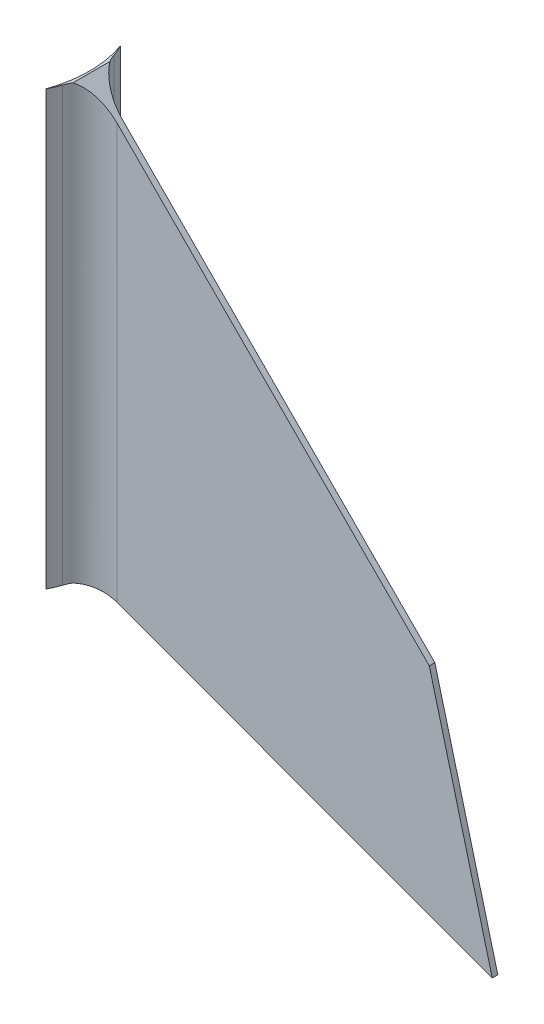
ISO-10303-21;
HEADER;
FILE_DESCRIPTION(('STEP AP214'),'2;1');
FILE_NAME('part.step','',(''),(''),'','','');
FILE_SCHEMA(('AUTOMOTIVE_DESIGN { 1 0 10303 214 1 1 1 1 }'));
ENDSEC;
DATA;
#1=APPLICATION_CONTEXT('core data for automotive mechanical design processes');
#2=APPLICATION_PROTOCOL_DEFINITION('international standard','automotive_design',2000,#1);
#3=PRODUCT_CONTEXT('',#1,'mechanical');
#4=PRODUCT('Part','Part','',(#3));
#5=PRODUCT_RELATED_PRODUCT_CATEGORY('part','',(#4));
#6=PRODUCT_DEFINITION_FORMATION('','',#4);
#7=PRODUCT_DEFINITION_CONTEXT('part definition',#1,'design');
#8=PRODUCT_DEFINITION('design','',#6,#7);
#9=PRODUCT_DEFINITION_SHAPE('','',#8);
#10=(LENGTH_UNIT() NAMED_UNIT(*) SI_UNIT(.MILLI.,.METRE.));
#11=(NAMED_UNIT(*) PLANE_ANGLE_UNIT() SI_UNIT($,.RADIAN.));
#12=(NAMED_UNIT(*) SI_UNIT($,.STERADIAN.) SOLID_ANGLE_UNIT());
#13=UNCERTAINTY_MEASURE_WITH_UNIT(LENGTH_MEASURE(1.E-05),#10,'distance_accuracy_value','');
#14=(GEOMETRIC_REPRESENTATION_CONTEXT(3) GLOBAL_UNCERTAINTY_ASSIGNED_CONTEXT((#13)) GLOBAL_UNIT_ASSIGNED_CONTEXT((#10,
#11,#12)) REPRESENTATION_CONTEXT('',''));
#15=CARTESIAN_POINT('',(0.,0.,0.));
#16=DIRECTION('',(0.,0.,1.));
#17=DIRECTION('',(1.,0.,0.));
#18=AXIS2_PLACEMENT_3D('',#15,#16,#17);
#19=CARTESIAN_POINT('',(0.,0.,-1.5));
#20=DIRECTION('',(-0.344507703036126,-0.938783490773444,0.));
#21=DIRECTION('',(0.938783490773444,-0.344507703036126,0.));
#22=AXIS2_PLACEMENT_3D('',#19,#20,#21);
#23=PLANE('',#22);
#24=DIRECTION('',(0.,0.,1.));
#25=VECTOR('',#24,1.);
#26=CARTESIAN_POINT('',(218.,-80.,-1.5));
#27=LINE('',#26,#25);
#28=CARTESIAN_POINT('',(218.,-80.,-1.5));
#29=VERTEX_POINT('',#28);
#30=CARTESIAN_POINT('',(218.,-80.,1.5));
#31=VERTEX_POINT('',#30);
#32=EDGE_CURVE('E158',#29,#31,#27,.T.);
#33=ORIENTED_EDGE('',*,*,#32,.T.);
#34=DIRECTION('',(0.938783490773444,-0.344507703036126,0.));
#35=VECTOR('',#34,1.);
#36=CARTESIAN_POINT('',(0.,0.,1.5));
#37=LINE('',#36,#35);
#38=CARTESIAN_POINT('',(15.2878394117452,-5.61021629788816,1.5));
#39=VERTEX_POINT('',#38);
#40=EDGE_CURVE('E138',#39,#31,#37,.T.);
#41=ORIENTED_EDGE('',*,*,#40,.F.);
#42=CARTESIAN_POINT('',(15.2878394117452,-5.61021629788816,19.5));
#43=DIRECTION('',(-0.344507703036126,-0.938783490773444,0.));
#44=DIRECTION('',(0.938783490773444,-0.344507703036126,0.));
#45=AXIS2_PLACEMENT_3D('',#42,#43,#44);
#46=ELLIPSE('',#45,19.1737500466377,18.);
#47=CARTESIAN_POINT('',(0.,0.,9.9983177215459));
#48=VERTEX_POINT('',#47);
#49=EDGE_CURVE('E174',#39,#48,#46,.F.);
#50=ORIENTED_EDGE('',*,*,#49,.T.);
#51=DIRECTION('',(0.,0.,1.));
#52=VECTOR('',#51,1.);
#53=CARTESIAN_POINT('',(0.,0.,-1.5));
#54=LINE('',#53,#52);
#55=CARTESIAN_POINT('',(0.,0.,-9.9983177215459));
#56=VERTEX_POINT('',#55);
#57=EDGE_CURVE('E59',#56,#48,#54,.T.);
#58=ORIENTED_EDGE('',*,*,#57,.F.);
#59=CARTESIAN_POINT('',(15.2878394117452,-5.61021629788816,-19.5));
#60=DIRECTION('',(-0.344507703036126,-0.938783490773444,0.));
#61=DIRECTION('',(0.938783490773444,-0.344507703036126,0.));
#62=AXIS2_PLACEMENT_3D('',#59,#60,#61);
#63=ELLIPSE('',#62,19.1737500466377,18.);
#64=CARTESIAN_POINT('',(15.2878394117452,-5.61021629788816,-1.5));
#65=VERTEX_POINT('',#64);
#66=EDGE_CURVE('E188',#56,#65,#63,.F.);
#67=ORIENTED_EDGE('',*,*,#66,.T.);
#68=DIRECTION('',(0.938783490773444,-0.344507703036126,0.));
#69=VECTOR('',#68,1.);
#70=CARTESIAN_POINT('',(0.,0.,-1.5));
#71=LINE('',#70,#69);
#72=EDGE_CURVE('E150',#65,#29,#71,.T.);
#73=ORIENTED_EDGE('',*,*,#72,.T.);
#74=EDGE_LOOP('',(#33,#41,#50,#58,#67,#73));
#75=FACE_BOUND('',#74,.T.);
#76=ADVANCED_FACE('F37',(#75),#23,.T.);
#77=CARTESIAN_POINT('',(-8.02704190106866E-13,234.,-1.5));
#78=DIRECTION('',(0.70902045612049,0.705187913114436,0.));
#79=DIRECTION('',(-0.705187913114436,0.70902045612049,0.));
#80=AXIS2_PLACEMENT_3D('',#77,#78,#79);
#81=PLANE('',#80);
#82=DIRECTION('',(0.,0.,1.));
#83=VECTOR('',#82,1.);
#84=CARTESIAN_POINT('',(-8.02704190106866E-13,234.,-1.5));
#85=LINE('',#84,#83);
#86=CARTESIAN_POINT('',(-8.02704190106866E-13,234.,-9.9983177215472));
#87=VERTEX_POINT('',#86);
#88=CARTESIAN_POINT('',(-8.02704190106866E-13,234.,9.99831772154719));
#89=VERTEX_POINT('',#88);
#90=EDGE_CURVE('E51',#87,#89,#85,.T.);
#91=ORIENTED_EDGE('',*,*,#90,.T.);
#92=CARTESIAN_POINT('',(15.2878394117452,218.629074504495,19.5));
#93=DIRECTION('',(0.70902045612049,0.705187913114436,0.));
#94=DIRECTION('',(0.705187913114436,-0.70902045612049,0.));
#95=AXIS2_PLACEMENT_3D('',#92,#93,#94);
#96=ELLIPSE('',#95,25.525111343023,18.);
#97=CARTESIAN_POINT('',(15.2878394117452,218.629074504495,1.5));
#98=VERTEX_POINT('',#97);
#99=EDGE_CURVE('E180',#89,#98,#96,.F.);
#100=ORIENTED_EDGE('',*,*,#99,.T.);
#101=DIRECTION('',(-0.705187913114436,0.70902045612049,0.));
#102=VECTOR('',#101,1.);
#103=CARTESIAN_POINT('',(-8.02704190106866E-13,234.,1.5));
#104=LINE('',#103,#102);
#105=CARTESIAN_POINT('',(184.,49.,1.5));
#106=VERTEX_POINT('',#105);
#107=EDGE_CURVE('E147',#106,#98,#104,.T.);
#108=ORIENTED_EDGE('',*,*,#107,.F.);
#109=DIRECTION('',(0.,0.,1.));
#110=VECTOR('',#109,1.);
#111=CARTESIAN_POINT('',(184.,49.,-1.5));
#112=LINE('',#111,#110);
#113=CARTESIAN_POINT('',(184.,49.,-1.5));
#114=VERTEX_POINT('',#113);
#115=EDGE_CURVE('E161',#114,#106,#112,.T.);
#116=ORIENTED_EDGE('',*,*,#115,.F.);
#117=DIRECTION('',(-0.705187913114436,0.70902045612049,0.));
#118=VECTOR('',#117,1.);
#119=CARTESIAN_POINT('',(-8.02704190106866E-13,234.,-1.5));
#120=LINE('',#119,#118);
#121=CARTESIAN_POINT('',(15.2878394117452,218.629074504495,-1.5));
#122=VERTEX_POINT('',#121);
#123=EDGE_CURVE('E155',#114,#122,#120,.T.);
#124=ORIENTED_EDGE('',*,*,#123,.T.);
#125=CARTESIAN_POINT('',(15.2878394117452,218.629074504495,-19.5));
#126=DIRECTION('',(0.70902045612049,0.705187913114436,0.));
#127=DIRECTION('',(0.705187913114436,-0.70902045612049,0.));
#128=AXIS2_PLACEMENT_3D('',#125,#126,#127);
#129=ELLIPSE('',#128,25.525111343023,18.);
#130=EDGE_CURVE('E45',#122,#87,#129,.F.);
#131=ORIENTED_EDGE('',*,*,#130,.T.);
#132=EDGE_LOOP('',(#91,#100,#108,#116,#124,#131));
#133=FACE_BOUND('',#132,.T.);
#134=ADVANCED_FACE('F191',(#133),#81,.T.);
#135=CARTESIAN_POINT('',(184.,49.,-1.5));
#136=DIRECTION('',(0.966977369095331,0.254862252319701,0.));
#137=DIRECTION('',(-0.254862252319701,0.966977369095332,0.));
#138=AXIS2_PLACEMENT_3D('',#135,#136,#137);
#139=PLANE('',#138);
#140=ORIENTED_EDGE('',*,*,#115,.T.);
#141=DIRECTION('',(-0.254862252319701,0.966977369095332,0.));
#142=VECTOR('',#141,1.);
#143=CARTESIAN_POINT('',(184.,49.,1.5));
#144=LINE('',#143,#142);
#145=EDGE_CURVE('E140',#31,#106,#144,.T.);
#146=ORIENTED_EDGE('',*,*,#145,.F.);
#147=ORIENTED_EDGE('',*,*,#32,.F.);
#148=DIRECTION('',(-0.254862252319701,0.966977369095332,0.));
#149=VECTOR('',#148,1.);
#150=CARTESIAN_POINT('',(184.,49.,-1.5));
#151=LINE('',#150,#149);
#152=EDGE_CURVE('E152',#29,#114,#151,.T.);
#153=ORIENTED_EDGE('',*,*,#152,.T.);
#154=EDGE_LOOP('',(#140,#146,#147,#153));
#155=FACE_BOUND('',#154,.T.);
#156=ADVANCED_FACE('F215',(#155),#139,.T.);
#157=CARTESIAN_POINT('',(0.,0.,-1.5));
#158=DIRECTION('',(0.,0.,1.));
#159=DIRECTION('',(1.,0.,0.));
#160=AXIS2_PLACEMENT_3D('',#157,#158,#159);
#161=PLANE('',#160);
#162=ORIENTED_EDGE('',*,*,#72,.F.);
#163=DIRECTION('',(0.,-1.,0.));
#164=VECTOR('',#163,1.);
#165=CARTESIAN_POINT('',(15.2878394117452,0.,-1.5));
#166=LINE('',#165,#164);
#167=EDGE_CURVE('E184',#65,#122,#166,.F.);
#168=ORIENTED_EDGE('',*,*,#167,.T.);
#169=ORIENTED_EDGE('',*,*,#123,.F.);
#170=ORIENTED_EDGE('',*,*,#152,.F.);
#171=EDGE_LOOP('',(#162,#168,#169,#170));
#172=FACE_BOUND('',#171,.T.);
#173=ADVANCED_FACE('F219',(#172),#161,.F.);
#174=CARTESIAN_POINT('',(0.,0.,1.5));
#175=DIRECTION('',(0.,0.,1.));
#176=DIRECTION('',(1.,0.,0.));
#177=AXIS2_PLACEMENT_3D('',#174,#175,#176);
#178=PLANE('',#177);
#179=ORIENTED_EDGE('',*,*,#107,.T.);
#180=DIRECTION('',(0.,1.,0.));
#181=VECTOR('',#180,1.);
#182=CARTESIAN_POINT('',(15.2878394117452,0.,1.5));
#183=LINE('',#182,#181);
#184=EDGE_CURVE('E169',#98,#39,#183,.F.);
#185=ORIENTED_EDGE('',*,*,#184,.T.);
#186=ORIENTED_EDGE('',*,*,#40,.T.);
#187=ORIENTED_EDGE('',*,*,#145,.T.);
#188=EDGE_LOOP('',(#179,#185,#186,#187));
#189=FACE_BOUND('',#188,.T.);
#190=ADVANCED_FACE('F210',(#189),#178,.T.);
#191=CARTESIAN_POINT('',(-61.,234.,0.));
#192=DIRECTION('',(0.,-1.,0.));
#193=DIRECTION('',(0.,0.,-1.));
#194=AXIS2_PLACEMENT_3D('',#191,#192,#193);
#195=CYLINDRICAL_SURFACE('',#194,60.);
#196=CARTESIAN_POINT('',(-61.,0.,0.));
#197=DIRECTION('',(0.,1.,0.));
#198=DIRECTION('',(0.,0.,1.));
#199=AXIS2_PLACEMENT_3D('',#196,#197,#198);
#200=CIRCLE('',#199,60.);
#201=CARTESIAN_POINT('',(-4.4314575050762,0.,20.));
#202=VERTEX_POINT('',#201);
#203=CARTESIAN_POINT('',(-4.4314575050762,0.,-20.));
#204=VERTEX_POINT('',#203);
#205=EDGE_CURVE('E134',#202,#204,#200,.T.);
#206=ORIENTED_EDGE('',*,*,#205,.F.);
#207=DIRECTION('',(0.,-1.,0.));
#208=VECTOR('',#207,1.);
#209=CARTESIAN_POINT('',(-4.4314575050762,234.,20.));
#210=LINE('',#209,#208);
#211=CARTESIAN_POINT('',(-4.4314575050762,234.,20.));
#212=VERTEX_POINT('',#211);
#213=EDGE_CURVE('E133',#212,#202,#210,.T.);
#214=ORIENTED_EDGE('',*,*,#213,.F.);
#215=CARTESIAN_POINT('',(-61.,234.,0.));
#216=DIRECTION('',(0.,1.,0.));
#217=DIRECTION('',(0.,0.,1.));
#218=AXIS2_PLACEMENT_3D('',#215,#216,#217);
#219=CIRCLE('',#218,60.);
#220=CARTESIAN_POINT('',(-4.4314575050762,234.,-20.));
#221=VERTEX_POINT('',#220);
#222=EDGE_CURVE('E116',#212,#221,#219,.T.);
#223=ORIENTED_EDGE('',*,*,#222,.T.);
#224=DIRECTION('',(0.,-1.,0.));
#225=VECTOR('',#224,1.);
#226=CARTESIAN_POINT('',(-4.4314575050762,234.,-20.));
#227=LINE('',#226,#225);
#228=EDGE_CURVE('E130',#221,#204,#227,.T.);
#229=ORIENTED_EDGE('',*,*,#228,.T.);
#230=EDGE_LOOP('',(#206,#214,#223,#229));
#231=FACE_BOUND('',#230,.T.);
#232=ADVANCED_FACE('F129',(#231),#195,.F.);
#233=CARTESIAN_POINT('',(-61.,234.,0.));
#234=DIRECTION('',(0.,1.,0.));
#235=DIRECTION('',(0.,0.,1.));
#236=AXIS2_PLACEMENT_3D('',#233,#234,#235);
#237=PLANE('',#236);
#238=ORIENTED_EDGE('',*,*,#222,.F.);
#239=CARTESIAN_POINT('',(-37.,234.,2.44180989519871));
#240=DIRECTION('',(0.,1.,0.));
#241=DIRECTION('',(0.,0.,1.));
#242=AXIS2_PLACEMENT_3D('',#239,#240,#241);
#243=CIRCLE('',#242,37.);
#244=CARTESIAN_POINT('',(-1.82454439573502,234.,13.917319602065));
#245=VERTEX_POINT('',#244);
#246=EDGE_CURVE('E167',#212,#245,#243,.T.);
#247=ORIENTED_EDGE('',*,*,#246,.T.);
#248=CARTESIAN_POINT('',(15.2878394117452,234.,19.5));
#249=DIRECTION('',(0.,1.,0.));
#250=DIRECTION('',(0.,0.,1.));
#251=AXIS2_PLACEMENT_3D('',#248,#249,#250);
#252=CIRCLE('',#251,18.);
#253=EDGE_CURVE('E178',#245,#89,#252,.F.);
#254=ORIENTED_EDGE('',*,*,#253,.T.);
#255=ORIENTED_EDGE('',*,*,#90,.F.);
#256=CARTESIAN_POINT('',(15.2878394117452,234.,-19.5));
#257=DIRECTION('',(0.,1.,0.));
#258=DIRECTION('',(0.,0.,1.));
#259=AXIS2_PLACEMENT_3D('',#256,#257,#258);
#260=CIRCLE('',#259,18.);
#261=CARTESIAN_POINT('',(-1.82454439573502,234.,-13.917319602065));
#262=VERTEX_POINT('',#261);
#263=EDGE_CURVE('E11',#87,#262,#260,.F.);
#264=ORIENTED_EDGE('',*,*,#263,.T.);
#265=CARTESIAN_POINT('',(-37.,234.,-2.44180989519871));
#266=DIRECTION('',(0.,1.,0.));
#267=DIRECTION('',(0.,0.,1.));
#268=AXIS2_PLACEMENT_3D('',#265,#266,#267);
#269=CIRCLE('',#268,37.);
#270=EDGE_CURVE('E112',#262,#221,#269,.T.);
#271=ORIENTED_EDGE('',*,*,#270,.T.);
#272=EDGE_LOOP('',(#238,#247,#254,#255,#264,#271));
#273=FACE_BOUND('',#272,.T.);
#274=ADVANCED_FACE('F114',(#273),#237,.T.);
#275=CARTESIAN_POINT('',(-61.,0.,0.));
#276=DIRECTION('',(0.,1.,0.));
#277=DIRECTION('',(0.,0.,1.));
#278=AXIS2_PLACEMENT_3D('',#275,#276,#277);
#279=PLANE('',#278);
#280=ORIENTED_EDGE('',*,*,#57,.T.);
#281=CARTESIAN_POINT('',(15.2878394117452,0.,19.5));
#282=DIRECTION('',(0.,1.,0.));
#283=DIRECTION('',(0.,0.,1.));
#284=AXIS2_PLACEMENT_3D('',#281,#282,#283);
#285=CIRCLE('',#284,18.);
#286=CARTESIAN_POINT('',(-1.82454439573502,0.,13.917319602065));
#287=VERTEX_POINT('',#286);
#288=EDGE_CURVE('E176',#48,#287,#285,.T.);
#289=ORIENTED_EDGE('',*,*,#288,.T.);
#290=CARTESIAN_POINT('',(-37.,0.,2.44180989519871));
#291=DIRECTION('',(0.,1.,0.));
#292=DIRECTION('',(0.,0.,1.));
#293=AXIS2_PLACEMENT_3D('',#290,#291,#292);
#294=CIRCLE('',#293,37.);
#295=EDGE_CURVE('E123',#287,#202,#294,.F.);
#296=ORIENTED_EDGE('',*,*,#295,.T.);
#297=ORIENTED_EDGE('',*,*,#205,.T.);
#298=CARTESIAN_POINT('',(-37.,0.,-2.44180989519871));
#299=DIRECTION('',(0.,1.,0.));
#300=DIRECTION('',(0.,0.,1.));
#301=AXIS2_PLACEMENT_3D('',#298,#299,#300);
#302=CIRCLE('',#301,37.);
#303=CARTESIAN_POINT('',(-1.82454439573502,0.,-13.917319602065));
#304=VERTEX_POINT('',#303);
#305=EDGE_CURVE('E124',#204,#304,#302,.F.);
#306=ORIENTED_EDGE('',*,*,#305,.T.);
#307=CARTESIAN_POINT('',(15.2878394117452,0.,-19.5));
#308=DIRECTION('',(0.,1.,0.));
#309=DIRECTION('',(0.,0.,1.));
#310=AXIS2_PLACEMENT_3D('',#307,#308,#309);
#311=CIRCLE('',#310,18.);
#312=EDGE_CURVE('E186',#304,#56,#311,.T.);
#313=ORIENTED_EDGE('',*,*,#312,.T.);
#314=EDGE_LOOP('',(#280,#289,#296,#297,#306,#313));
#315=FACE_BOUND('',#314,.T.);
#316=ADVANCED_FACE('F197',(#315),#279,.F.);
#317=CARTESIAN_POINT('',(-37.,234.,-2.44180989519871));
#318=DIRECTION('',(0.,-1.,0.));
#319=DIRECTION('',(0.,0.,-1.));
#320=AXIS2_PLACEMENT_3D('',#317,#318,#319);
#321=CYLINDRICAL_SURFACE('',#320,37.);
#322=ORIENTED_EDGE('',*,*,#270,.F.);
#323=DIRECTION('',(0.,-1.,0.));
#324=VECTOR('',#323,1.);
#325=CARTESIAN_POINT('',(-1.82454439573502,234.,-13.917319602065));
#326=LINE('',#325,#324);
#327=EDGE_CURVE('E182',#262,#304,#326,.T.);
#328=ORIENTED_EDGE('',*,*,#327,.T.);
#329=ORIENTED_EDGE('',*,*,#305,.F.);
#330=ORIENTED_EDGE('',*,*,#228,.F.);
#331=EDGE_LOOP('',(#322,#328,#329,#330));
#332=FACE_BOUND('',#331,.T.);
#333=ADVANCED_FACE('F136',(#332),#321,.T.);
#334=CARTESIAN_POINT('',(-37.,234.,2.44180989519871));
#335=DIRECTION('',(0.,-1.,0.));
#336=DIRECTION('',(0.,0.,-1.));
#337=AXIS2_PLACEMENT_3D('',#334,#335,#336);
#338=CYLINDRICAL_SURFACE('',#337,37.);
#339=ORIENTED_EDGE('',*,*,#295,.F.);
#340=DIRECTION('',(0.,-1.,0.));
#341=VECTOR('',#340,1.);
#342=CARTESIAN_POINT('',(-1.82454439573501,234.,13.917319602065));
#343=LINE('',#342,#341);
#344=EDGE_CURVE('E172',#287,#245,#343,.F.);
#345=ORIENTED_EDGE('',*,*,#344,.T.);
#346=ORIENTED_EDGE('',*,*,#246,.F.);
#347=ORIENTED_EDGE('',*,*,#213,.T.);
#348=EDGE_LOOP('',(#339,#345,#346,#347));
#349=FACE_BOUND('',#348,.T.);
#350=ADVANCED_FACE('F200',(#349),#338,.T.);
#351=CARTESIAN_POINT('',(15.2878394117452,234.,19.5));
#352=DIRECTION('',(0.,-1.,0.));
#353=DIRECTION('',(0.,0.,-1.));
#354=AXIS2_PLACEMENT_3D('',#351,#352,#353);
#355=CYLINDRICAL_SURFACE('',#354,18.);
#356=ORIENTED_EDGE('',*,*,#253,.F.);
#357=ORIENTED_EDGE('',*,*,#344,.F.);
#358=ORIENTED_EDGE('',*,*,#288,.F.);
#359=ORIENTED_EDGE('',*,*,#49,.F.);
#360=ORIENTED_EDGE('',*,*,#184,.F.);
#361=ORIENTED_EDGE('',*,*,#99,.F.);
#362=EDGE_LOOP('',(#356,#357,#358,#359,#360,#361));
#363=FACE_BOUND('',#362,.T.);
#364=ADVANCED_FACE('F205',(#363),#355,.F.);
#365=CARTESIAN_POINT('',(15.2878394117452,234.,-19.5));
#366=DIRECTION('',(0.,-1.,0.));
#367=DIRECTION('',(0.,0.,-1.));
#368=AXIS2_PLACEMENT_3D('',#365,#366,#367);
#369=CYLINDRICAL_SURFACE('',#368,18.);
#370=ORIENTED_EDGE('',*,*,#130,.F.);
#371=ORIENTED_EDGE('',*,*,#167,.F.);
#372=ORIENTED_EDGE('',*,*,#66,.F.);
#373=ORIENTED_EDGE('',*,*,#312,.F.);
#374=ORIENTED_EDGE('',*,*,#327,.F.);
#375=ORIENTED_EDGE('',*,*,#263,.F.);
#376=EDGE_LOOP('',(#370,#371,#372,#373,#374,#375));
#377=FACE_BOUND('',#376,.T.);
#378=ADVANCED_FACE('F39',(#377),#369,.F.);
#379=CLOSED_SHELL('',(#76,#134,#156,#173,#190,#232,#274,#316,#333,#350,#364,#378));
#380=MANIFOLD_SOLID_BREP('B2',#379);
#381=ADVANCED_BREP_SHAPE_REPRESENTATION('',(#18,#380),#14);
#382=SHAPE_DEFINITION_REPRESENTATION(#9,#381);
ENDSEC;
END-ISO-10303-21;
